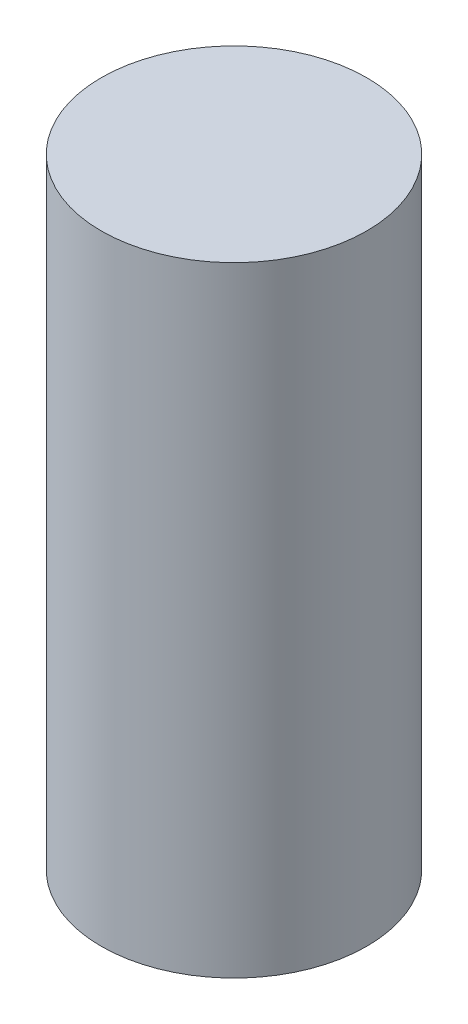
ISO-10303-21;
HEADER;
FILE_DESCRIPTION(('STEP AP214'),'2;1');
FILE_NAME('part.step','',(''),(''),'','','');
FILE_SCHEMA(('AUTOMOTIVE_DESIGN { 1 0 10303 214 1 1 1 1 }'));
ENDSEC;
DATA;
#1=APPLICATION_CONTEXT('core data for automotive mechanical design processes');
#2=APPLICATION_PROTOCOL_DEFINITION('international standard','automotive_design',2000,#1);
#3=PRODUCT_CONTEXT('',#1,'mechanical');
#4=PRODUCT('Part','Part','',(#3));
#5=PRODUCT_RELATED_PRODUCT_CATEGORY('part','',(#4));
#6=PRODUCT_DEFINITION_FORMATION('','',#4);
#7=PRODUCT_DEFINITION_CONTEXT('part definition',#1,'design');
#8=PRODUCT_DEFINITION('design','',#6,#7);
#9=PRODUCT_DEFINITION_SHAPE('','',#8);
#10=(LENGTH_UNIT() NAMED_UNIT(*) SI_UNIT(.MILLI.,.METRE.));
#11=(NAMED_UNIT(*) PLANE_ANGLE_UNIT() SI_UNIT($,.RADIAN.));
#12=(NAMED_UNIT(*) SI_UNIT($,.STERADIAN.) SOLID_ANGLE_UNIT());
#13=UNCERTAINTY_MEASURE_WITH_UNIT(LENGTH_MEASURE(1.E-05),#10,'distance_accuracy_value','');
#14=(GEOMETRIC_REPRESENTATION_CONTEXT(3) GLOBAL_UNCERTAINTY_ASSIGNED_CONTEXT((#13)) GLOBAL_UNIT_ASSIGNED_CONTEXT((#10,
#11,#12)) REPRESENTATION_CONTEXT('',''));
#15=CARTESIAN_POINT('',(0.,0.,0.));
#16=DIRECTION('',(0.,0.,1.));
#17=DIRECTION('',(1.,0.,0.));
#18=AXIS2_PLACEMENT_3D('',#15,#16,#17);
#19=CARTESIAN_POINT('',(0.,35.,0.));
#20=DIRECTION('',(0.,-1.,0.));
#21=DIRECTION('',(0.,0.,-1.));
#22=AXIS2_PLACEMENT_3D('',#19,#20,#21);
#23=CYLINDRICAL_SURFACE('',#22,7.5);
#24=CARTESIAN_POINT('',(0.,35.,0.));
#25=DIRECTION('',(0.,1.,0.));
#26=DIRECTION('',(0.,0.,1.));
#27=AXIS2_PLACEMENT_3D('',#24,#25,#26);
#28=CIRCLE('',#27,7.5);
#29=CARTESIAN_POINT('',(0.,35.,7.5));
#30=VERTEX_POINT('',#29);
#31=EDGE_CURVE('E10',#30,#30,#28,.T.);
#32=ORIENTED_EDGE('',*,*,#31,.F.);
#33=EDGE_LOOP('',(#32));
#34=FACE_BOUND('',#33,.T.);
#35=CARTESIAN_POINT('',(0.,0.,0.));
#36=DIRECTION('',(0.,1.,0.));
#37=DIRECTION('',(0.,0.,1.));
#38=AXIS2_PLACEMENT_3D('',#35,#36,#37);
#39=CIRCLE('',#38,7.5);
#40=CARTESIAN_POINT('',(0.,0.,7.5));
#41=VERTEX_POINT('',#40);
#42=EDGE_CURVE('E33',#41,#41,#39,.T.);
#43=ORIENTED_EDGE('',*,*,#42,.T.);
#44=EDGE_LOOP('',(#43));
#45=FACE_BOUND('',#44,.T.);
#46=ADVANCED_FACE('F30',(#34,#45),#23,.T.);
#47=CARTESIAN_POINT('',(0.,35.,0.));
#48=DIRECTION('',(0.,1.,0.));
#49=DIRECTION('',(0.,0.,1.));
#50=AXIS2_PLACEMENT_3D('',#47,#48,#49);
#51=PLANE('',#50);
#52=ORIENTED_EDGE('',*,*,#31,.T.);
#53=EDGE_LOOP('',(#52));
#54=FACE_BOUND('',#53,.T.);
#55=ADVANCED_FACE('F45',(#54),#51,.T.);
#56=CARTESIAN_POINT('',(0.,0.,0.));
#57=DIRECTION('',(0.,1.,0.));
#58=DIRECTION('',(0.,0.,1.));
#59=AXIS2_PLACEMENT_3D('',#56,#57,#58);
#60=PLANE('',#59);
#61=ORIENTED_EDGE('',*,*,#42,.F.);
#62=EDGE_LOOP('',(#61));
#63=FACE_BOUND('',#62,.T.);
#64=ADVANCED_FACE('F43',(#63),#60,.F.);
#65=CLOSED_SHELL('',(#46,#55,#64));
#66=MANIFOLD_SOLID_BREP('B2',#65);
#67=ADVANCED_BREP_SHAPE_REPRESENTATION('',(#18,#66),#14);
#68=SHAPE_DEFINITION_REPRESENTATION(#9,#67);
ENDSEC;
END-ISO-10303-21;
